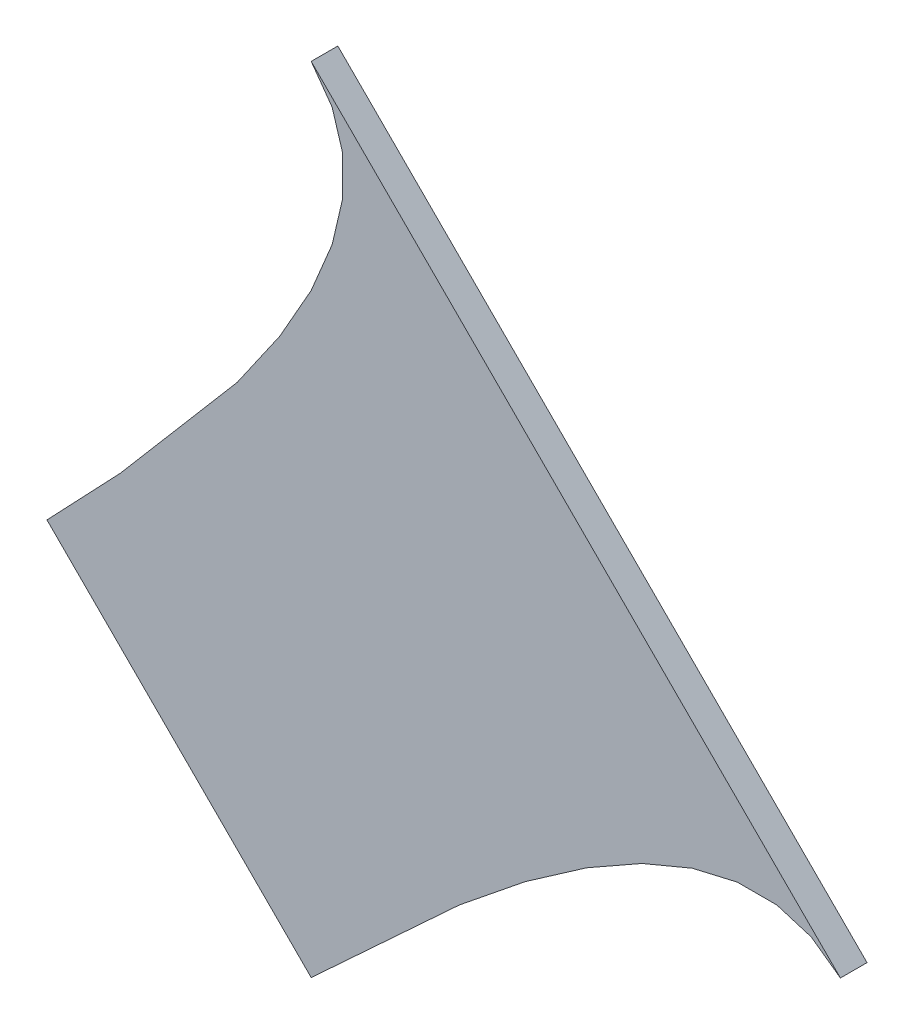
ISO-10303-21;
HEADER;
FILE_DESCRIPTION(('STEP AP214'),'2;1');
FILE_NAME('part.step','',(''),(''),'','','');
FILE_SCHEMA(('AUTOMOTIVE_DESIGN { 1 0 10303 214 1 1 1 1 }'));
ENDSEC;
DATA;
#1=APPLICATION_CONTEXT('core data for automotive mechanical design processes');
#2=APPLICATION_PROTOCOL_DEFINITION('international standard','automotive_design',2000,#1);
#3=PRODUCT_CONTEXT('',#1,'mechanical');
#4=PRODUCT('Part','Part','',(#3));
#5=PRODUCT_RELATED_PRODUCT_CATEGORY('part','',(#4));
#6=PRODUCT_DEFINITION_FORMATION('','',#4);
#7=PRODUCT_DEFINITION_CONTEXT('part definition',#1,'design');
#8=PRODUCT_DEFINITION('design','',#6,#7);
#9=PRODUCT_DEFINITION_SHAPE('','',#8);
#10=(LENGTH_UNIT() NAMED_UNIT(*) SI_UNIT(.MILLI.,.METRE.));
#11=(NAMED_UNIT(*) PLANE_ANGLE_UNIT() SI_UNIT($,.RADIAN.));
#12=(NAMED_UNIT(*) SI_UNIT($,.STERADIAN.) SOLID_ANGLE_UNIT());
#13=UNCERTAINTY_MEASURE_WITH_UNIT(LENGTH_MEASURE(1.E-05),#10,'distance_accuracy_value','');
#14=(GEOMETRIC_REPRESENTATION_CONTEXT(3) GLOBAL_UNCERTAINTY_ASSIGNED_CONTEXT((#13)) GLOBAL_UNIT_ASSIGNED_CONTEXT((#10,
#11,#12)) REPRESENTATION_CONTEXT('',''));
#15=CARTESIAN_POINT('',(0.,0.,0.));
#16=DIRECTION('',(0.,0.,1.));
#17=DIRECTION('',(1.,0.,0.));
#18=AXIS2_PLACEMENT_3D('',#15,#16,#17);
#19=CARTESIAN_POINT('',(90.5439987182617,115.928001403809,0.));
#20=DIRECTION('',(-0.678743033938284,0.734375853279677,0.));
#21=DIRECTION('',(0.734375853279677,0.678743033938284,0.));
#22=AXIS2_PLACEMENT_3D('',#19,#20,#21);
#23=PLANE('',#22);
#24=DIRECTION('',(0.734375853279677,0.678743033938284,0.));
#25=VECTOR('',#24,1.);
#26=CARTESIAN_POINT('',(90.5439987182617,115.928001403809,0.03556));
#27=LINE('',#26,#25);
#28=CARTESIAN_POINT('',(90.5439987182617,115.928001403809,0.03556));
#29=VERTEX_POINT('',#28);
#30=CARTESIAN_POINT('',(90.7419967651367,116.111000061035,0.03556));
#31=VERTEX_POINT('',#30);
#32=EDGE_CURVE('E11',#29,#31,#27,.T.);
#33=ORIENTED_EDGE('',*,*,#32,.F.);
#34=DIRECTION('',(0.,0.,1.));
#35=VECTOR('',#34,1.);
#36=CARTESIAN_POINT('',(90.5439987182617,115.928001403809,0.));
#37=LINE('',#36,#35);
#38=CARTESIAN_POINT('',(90.5439987182617,115.928001403809,0.));
#39=VERTEX_POINT('',#38);
#40=EDGE_CURVE('E24',#39,#29,#37,.T.);
#41=ORIENTED_EDGE('',*,*,#40,.F.);
#42=DIRECTION('',(0.734375853279677,0.678743033938284,0.));
#43=VECTOR('',#42,1.);
#44=CARTESIAN_POINT('',(90.5439987182617,115.928001403809,0.));
#45=LINE('',#44,#43);
#46=CARTESIAN_POINT('',(90.7419967651367,116.111000061035,0.));
#47=VERTEX_POINT('',#46);
#48=EDGE_CURVE('E172',#39,#47,#45,.T.);
#49=ORIENTED_EDGE('',*,*,#48,.T.);
#50=DIRECTION('',(0.,0.,1.));
#51=VECTOR('',#50,1.);
#52=CARTESIAN_POINT('',(90.7419967651367,116.111000061035,0.));
#53=LINE('',#52,#51);
#54=EDGE_CURVE('E37',#47,#31,#53,.T.);
#55=ORIENTED_EDGE('',*,*,#54,.T.);
#56=EDGE_LOOP('',(#33,#41,#49,#55));
#57=FACE_BOUND('',#56,.T.);
#58=ADVANCED_FACE('F17',(#57),#23,.F.);
#59=CARTESIAN_POINT('',(90.7419967651367,116.111000061035,0.));
#60=DIRECTION('',(-0.627898828977901,0.778294970154748,0.));
#61=DIRECTION('',(0.778294970154748,0.627898828977901,0.));
#62=AXIS2_PLACEMENT_3D('',#59,#60,#61);
#63=PLANE('',#62);
#64=DIRECTION('',(0.778294970154748,0.627898828977901,0.));
#65=VECTOR('',#64,1.);
#66=CARTESIAN_POINT('',(90.7419967651367,116.111000061035,0.03556));
#67=LINE('',#66,#65);
#68=CARTESIAN_POINT('',(90.8300018310547,116.181999206543,0.03556));
#69=VERTEX_POINT('',#68);
#70=EDGE_CURVE('E308',#31,#69,#67,.T.);
#71=ORIENTED_EDGE('',*,*,#70,.F.);
#72=ORIENTED_EDGE('',*,*,#54,.F.);
#73=DIRECTION('',(0.778294970154748,0.627898828977901,0.));
#74=VECTOR('',#73,1.);
#75=CARTESIAN_POINT('',(90.7419967651367,116.111000061035,0.));
#76=LINE('',#75,#74);
#77=CARTESIAN_POINT('',(90.8300018310547,116.181999206543,0.));
#78=VERTEX_POINT('',#77);
#79=EDGE_CURVE('E305',#47,#78,#76,.T.);
#80=ORIENTED_EDGE('',*,*,#79,.T.);
#81=DIRECTION('',(0.,0.,1.));
#82=VECTOR('',#81,1.);
#83=CARTESIAN_POINT('',(90.8300018310547,116.181999206543,0.));
#84=LINE('',#83,#82);
#85=EDGE_CURVE('E303',#78,#69,#84,.T.);
#86=ORIENTED_EDGE('',*,*,#85,.T.);
#87=EDGE_LOOP('',(#71,#72,#80,#86));
#88=FACE_BOUND('',#87,.T.);
#89=ADVANCED_FACE('F316',(#88),#63,.F.);
#90=CARTESIAN_POINT('',(90.8300018310547,116.181999206543,0.));
#91=DIRECTION('',(-0.570762267595056,0.821115359672287,0.));
#92=DIRECTION('',(0.821115359672287,0.570762267595056,0.));
#93=AXIS2_PLACEMENT_3D('',#90,#91,#92);
#94=PLANE('',#93);
#95=DIRECTION('',(0.821115359672287,0.570762267595056,0.));
#96=VECTOR('',#95,1.);
#97=CARTESIAN_POINT('',(90.8300018310547,116.181999206543,0.03556));
#98=LINE('',#97,#96);
#99=CARTESIAN_POINT('',(90.9120025634766,116.238998413086,0.03556));
#100=VERTEX_POINT('',#99);
#101=EDGE_CURVE('E300',#69,#100,#98,.T.);
#102=ORIENTED_EDGE('',*,*,#101,.F.);
#103=ORIENTED_EDGE('',*,*,#85,.F.);
#104=DIRECTION('',(0.821115359672287,0.570762267595056,0.));
#105=VECTOR('',#104,1.);
#106=CARTESIAN_POINT('',(90.8300018310547,116.181999206543,0.));
#107=LINE('',#106,#105);
#108=CARTESIAN_POINT('',(90.9120025634766,116.238998413086,0.));
#109=VERTEX_POINT('',#108);
#110=EDGE_CURVE('E297',#78,#109,#107,.T.);
#111=ORIENTED_EDGE('',*,*,#110,.T.);
#112=DIRECTION('',(0.,0.,1.));
#113=VECTOR('',#112,1.);
#114=CARTESIAN_POINT('',(90.9120025634766,116.238998413086,0.));
#115=LINE('',#114,#113);
#116=EDGE_CURVE('E295',#109,#100,#115,.T.);
#117=ORIENTED_EDGE('',*,*,#116,.T.);
#118=EDGE_LOOP('',(#102,#103,#111,#117));
#119=FACE_BOUND('',#118,.T.);
#120=ADVANCED_FACE('F322',(#119),#94,.F.);
#121=CARTESIAN_POINT('',(90.9120025634766,116.238998413086,0.));
#122=DIRECTION('',(-0.493616517242774,0.869679673158522,0.));
#123=DIRECTION('',(0.869679673158522,0.493616517242774,0.));
#124=AXIS2_PLACEMENT_3D('',#121,#122,#123);
#125=PLANE('',#124);
#126=DIRECTION('',(0.869679673158522,0.493616517242774,0.));
#127=VECTOR('',#126,1.);
#128=CARTESIAN_POINT('',(90.9120025634766,116.238998413086,0.03556));
#129=LINE('',#128,#127);
#130=CARTESIAN_POINT('',(90.9860000610352,116.28099822998,0.03556));
#131=VERTEX_POINT('',#130);
#132=EDGE_CURVE('E292',#100,#131,#129,.T.);
#133=ORIENTED_EDGE('',*,*,#132,.F.);
#134=ORIENTED_EDGE('',*,*,#116,.F.);
#135=DIRECTION('',(0.869679673158522,0.493616517242774,0.));
#136=VECTOR('',#135,1.);
#137=CARTESIAN_POINT('',(90.9120025634766,116.238998413086,0.));
#138=LINE('',#137,#136);
#139=CARTESIAN_POINT('',(90.9860000610352,116.28099822998,0.));
#140=VERTEX_POINT('',#139);
#141=EDGE_CURVE('E289',#109,#140,#138,.T.);
#142=ORIENTED_EDGE('',*,*,#141,.T.);
#143=DIRECTION('',(0.,0.,1.));
#144=VECTOR('',#143,1.);
#145=CARTESIAN_POINT('',(90.9860000610352,116.28099822998,0.));
#146=LINE('',#145,#144);
#147=EDGE_CURVE('E287',#140,#131,#146,.T.);
#148=ORIENTED_EDGE('',*,*,#147,.T.);
#149=EDGE_LOOP('',(#133,#134,#142,#148));
#150=FACE_BOUND('',#149,.T.);
#151=ADVANCED_FACE('F324',(#150),#125,.F.);
#152=CARTESIAN_POINT('',(90.9860000610352,116.28099822998,0.));
#153=DIRECTION('',(-0.385584994163033,0.922672321182495,0.));
#154=DIRECTION('',(0.922672321182495,0.385584994163033,0.));
#155=AXIS2_PLACEMENT_3D('',#152,#153,#154);
#156=PLANE('',#155);
#157=DIRECTION('',(0.922672321182495,0.385584994163033,0.));
#158=VECTOR('',#157,1.);
#159=CARTESIAN_POINT('',(90.9860000610352,116.28099822998,0.03556));
#160=LINE('',#159,#158);
#161=CARTESIAN_POINT('',(91.0530014038086,116.30899810791,0.03556));
#162=VERTEX_POINT('',#161);
#163=EDGE_CURVE('E284',#131,#162,#160,.T.);
#164=ORIENTED_EDGE('',*,*,#163,.F.);
#165=ORIENTED_EDGE('',*,*,#147,.F.);
#166=DIRECTION('',(0.922672321182495,0.385584994163033,0.));
#167=VECTOR('',#166,1.);
#168=CARTESIAN_POINT('',(90.9860000610352,116.28099822998,0.));
#169=LINE('',#168,#167);
#170=CARTESIAN_POINT('',(91.0530014038086,116.30899810791,0.));
#171=VERTEX_POINT('',#170);
#172=EDGE_CURVE('E281',#140,#171,#169,.T.);
#173=ORIENTED_EDGE('',*,*,#172,.T.);
#174=DIRECTION('',(0.,0.,1.));
#175=VECTOR('',#174,1.);
#176=CARTESIAN_POINT('',(91.0530014038086,116.30899810791,0.));
#177=LINE('',#176,#175);
#178=EDGE_CURVE('E279',#171,#162,#177,.T.);
#179=ORIENTED_EDGE('',*,*,#178,.T.);
#180=EDGE_LOOP('',(#164,#165,#173,#179));
#181=FACE_BOUND('',#180,.T.);
#182=ADVANCED_FACE('F329',(#181),#156,.F.);
#183=CARTESIAN_POINT('',(91.0530014038086,116.30899810791,0.));
#184=DIRECTION('',(-0.227237445006023,0.973839382848699,0.));
#185=DIRECTION('',(0.973839382848699,0.227237445006023,0.));
#186=AXIS2_PLACEMENT_3D('',#183,#184,#185);
#187=PLANE('',#186);
#188=DIRECTION('',(0.973839382848699,0.227237445006023,0.));
#189=VECTOR('',#188,1.);
#190=CARTESIAN_POINT('',(91.0530014038086,116.30899810791,0.03556));
#191=LINE('',#190,#189);
#192=CARTESIAN_POINT('',(91.1129989624023,116.322998046875,0.03556));
#193=VERTEX_POINT('',#192);
#194=EDGE_CURVE('E276',#162,#193,#191,.T.);
#195=ORIENTED_EDGE('',*,*,#194,.F.);
#196=ORIENTED_EDGE('',*,*,#178,.F.);
#197=DIRECTION('',(0.973839382848699,0.227237445006023,0.));
#198=VECTOR('',#197,1.);
#199=CARTESIAN_POINT('',(91.0530014038086,116.30899810791,0.));
#200=LINE('',#199,#198);
#201=CARTESIAN_POINT('',(91.1129989624023,116.322998046875,0.));
#202=VERTEX_POINT('',#201);
#203=EDGE_CURVE('E273',#171,#202,#200,.T.);
#204=ORIENTED_EDGE('',*,*,#203,.T.);
#205=DIRECTION('',(0.,0.,1.));
#206=VECTOR('',#205,1.);
#207=CARTESIAN_POINT('',(91.1129989624023,116.322998046875,0.));
#208=LINE('',#207,#206);
#209=EDGE_CURVE('E271',#202,#193,#208,.T.);
#210=ORIENTED_EDGE('',*,*,#209,.T.);
#211=EDGE_LOOP('',(#195,#196,#204,#210));
#212=FACE_BOUND('',#211,.T.);
#213=ADVANCED_FACE('F332',(#212),#187,.F.);
#214=CARTESIAN_POINT('',(91.1129989624023,116.322998046875,0.));
#215=DIRECTION('',(0.,1.,0.));
#216=DIRECTION('',(1.,0.,0.));
#217=AXIS2_PLACEMENT_3D('',#214,#215,#216);
#218=PLANE('',#217);
#219=DIRECTION('',(1.,0.,0.));
#220=VECTOR('',#219,1.);
#221=CARTESIAN_POINT('',(91.1129989624023,116.322998046875,0.03556));
#222=LINE('',#221,#220);
#223=CARTESIAN_POINT('',(91.1660003662109,116.322998046875,0.03556));
#224=VERTEX_POINT('',#223);
#225=EDGE_CURVE('E268',#193,#224,#222,.T.);
#226=ORIENTED_EDGE('',*,*,#225,.F.);
#227=ORIENTED_EDGE('',*,*,#209,.F.);
#228=DIRECTION('',(1.,0.,0.));
#229=VECTOR('',#228,1.);
#230=CARTESIAN_POINT('',(91.1129989624023,116.322998046875,0.));
#231=LINE('',#230,#229);
#232=CARTESIAN_POINT('',(91.1660003662109,116.322998046875,0.));
#233=VERTEX_POINT('',#232);
#234=EDGE_CURVE('E265',#202,#233,#231,.T.);
#235=ORIENTED_EDGE('',*,*,#234,.T.);
#236=DIRECTION('',(0.,0.,1.));
#237=VECTOR('',#236,1.);
#238=CARTESIAN_POINT('',(91.1660003662109,116.322998046875,0.));
#239=LINE('',#238,#237);
#240=EDGE_CURVE('E263',#233,#224,#239,.T.);
#241=ORIENTED_EDGE('',*,*,#240,.T.);
#242=EDGE_LOOP('',(#226,#227,#235,#241));
#243=FACE_BOUND('',#242,.T.);
#244=ADVANCED_FACE('F337',(#243),#218,.F.);
#245=CARTESIAN_POINT('',(91.1660003662109,116.322998046875,0.));
#246=DIRECTION('',(0.291174244115219,0.956670036932239,0.));
#247=DIRECTION('',(0.956670036932239,-0.291174244115219,0.));
#248=AXIS2_PLACEMENT_3D('',#245,#246,#247);
#249=PLANE('',#248);
#250=DIRECTION('',(0.956670036932239,-0.291174244115219,0.));
#251=VECTOR('',#250,1.);
#252=CARTESIAN_POINT('',(91.1660003662109,116.322998046875,0.03556));
#253=LINE('',#252,#251);
#254=CARTESIAN_POINT('',(91.2119979858398,116.30899810791,0.03556));
#255=VERTEX_POINT('',#254);
#256=EDGE_CURVE('E260',#224,#255,#253,.T.);
#257=ORIENTED_EDGE('',*,*,#256,.F.);
#258=ORIENTED_EDGE('',*,*,#240,.F.);
#259=DIRECTION('',(0.956670036932239,-0.291174244115219,0.));
#260=VECTOR('',#259,1.);
#261=CARTESIAN_POINT('',(91.1660003662109,116.322998046875,0.));
#262=LINE('',#261,#260);
#263=CARTESIAN_POINT('',(91.2119979858398,116.30899810791,0.));
#264=VERTEX_POINT('',#263);
#265=EDGE_CURVE('E257',#233,#264,#262,.T.);
#266=ORIENTED_EDGE('',*,*,#265,.T.);
#267=DIRECTION('',(0.,0.,1.));
#268=VECTOR('',#267,1.);
#269=CARTESIAN_POINT('',(91.2119979858398,116.30899810791,0.));
#270=LINE('',#269,#268);
#271=EDGE_CURVE('E255',#264,#255,#270,.T.);
#272=ORIENTED_EDGE('',*,*,#271,.T.);
#273=EDGE_LOOP('',(#257,#258,#266,#272));
#274=FACE_BOUND('',#273,.T.);
#275=ADVANCED_FACE('F340',(#274),#249,.F.);
#276=CARTESIAN_POINT('',(91.2119979858398,116.30899810791,0.));
#277=DIRECTION('',(0.583190650931696,0.812335315412216,0.));
#278=DIRECTION('',(0.812335315412216,-0.583190650931696,0.));
#279=AXIS2_PLACEMENT_3D('',#276,#277,#278);
#280=PLANE('',#279);
#281=DIRECTION('',(0.812335315412216,-0.583190650931696,0.));
#282=VECTOR('',#281,1.);
#283=CARTESIAN_POINT('',(91.2119979858398,116.30899810791,0.03556));
#284=LINE('',#283,#282);
#285=CARTESIAN_POINT('',(91.2509994506836,116.28099822998,0.03556));
#286=VERTEX_POINT('',#285);
#287=EDGE_CURVE('E252',#255,#286,#284,.T.);
#288=ORIENTED_EDGE('',*,*,#287,.F.);
#289=ORIENTED_EDGE('',*,*,#271,.F.);
#290=DIRECTION('',(0.812335315412216,-0.583190650931696,0.));
#291=VECTOR('',#290,1.);
#292=CARTESIAN_POINT('',(91.2119979858398,116.30899810791,0.));
#293=LINE('',#292,#291);
#294=CARTESIAN_POINT('',(91.2509994506836,116.28099822998,0.));
#295=VERTEX_POINT('',#294);
#296=EDGE_CURVE('E249',#264,#295,#293,.T.);
#297=ORIENTED_EDGE('',*,*,#296,.T.);
#298=DIRECTION('',(0.,0.,1.));
#299=VECTOR('',#298,1.);
#300=CARTESIAN_POINT('',(91.2509994506836,116.28099822998,0.));
#301=LINE('',#300,#299);
#302=EDGE_CURVE('E247',#295,#286,#301,.T.);
#303=ORIENTED_EDGE('',*,*,#302,.T.);
#304=EDGE_LOOP('',(#288,#289,#297,#303));
#305=FACE_BOUND('',#304,.T.);
#306=ADVANCED_FACE('F345',(#305),#280,.F.);
#307=CARTESIAN_POINT('',(91.2509994506836,116.28099822998,0.));
#308=DIRECTION('',(-0.707106781186548,-0.707106781186548,0.));
#309=DIRECTION('',(-0.707106781186548,0.707106781186548,0.));
#310=AXIS2_PLACEMENT_3D('',#307,#308,#309);
#311=PLANE('',#310);
#312=DIRECTION('',(-0.707106781186548,0.707106781186548,0.));
#313=VECTOR('',#312,1.);
#314=CARTESIAN_POINT('',(91.2509994506836,116.28099822998,0.03556));
#315=LINE('',#314,#313);
#316=CARTESIAN_POINT('',(90.5439987182617,116.987998962402,0.03556));
#317=VERTEX_POINT('',#316);
#318=EDGE_CURVE('E244',#286,#317,#315,.T.);
#319=ORIENTED_EDGE('',*,*,#318,.F.);
#320=ORIENTED_EDGE('',*,*,#302,.F.);
#321=DIRECTION('',(-0.707106781186548,0.707106781186548,0.));
#322=VECTOR('',#321,1.);
#323=CARTESIAN_POINT('',(91.2509994506836,116.28099822998,0.));
#324=LINE('',#323,#322);
#325=CARTESIAN_POINT('',(90.5439987182617,116.987998962402,0.));
#326=VERTEX_POINT('',#325);
#327=EDGE_CURVE('E241',#295,#326,#324,.T.);
#328=ORIENTED_EDGE('',*,*,#327,.T.);
#329=DIRECTION('',(0.,0.,1.));
#330=VECTOR('',#329,1.);
#331=CARTESIAN_POINT('',(90.5439987182617,116.987998962402,0.));
#332=LINE('',#331,#330);
#333=EDGE_CURVE('E239',#326,#317,#332,.T.);
#334=ORIENTED_EDGE('',*,*,#333,.T.);
#335=EDGE_LOOP('',(#319,#320,#328,#334));
#336=FACE_BOUND('',#335,.T.);
#337=ADVANCED_FACE('F348',(#336),#311,.F.);
#338=CARTESIAN_POINT('',(90.5439987182617,116.987998962402,0.));
#339=DIRECTION('',(0.812335315412216,0.583190650931696,0.));
#340=DIRECTION('',(0.583190650931696,-0.812335315412216,0.));
#341=AXIS2_PLACEMENT_3D('',#338,#339,#340);
#342=PLANE('',#341);
#343=DIRECTION('',(0.583190650931696,-0.812335315412216,0.));
#344=VECTOR('',#343,1.);
#345=CARTESIAN_POINT('',(90.5439987182617,116.987998962402,0.03556));
#346=LINE('',#345,#344);
#347=CARTESIAN_POINT('',(90.5719985961914,116.948997497559,0.03556));
#348=VERTEX_POINT('',#347);
#349=EDGE_CURVE('E236',#317,#348,#346,.T.);
#350=ORIENTED_EDGE('',*,*,#349,.F.);
#351=ORIENTED_EDGE('',*,*,#333,.F.);
#352=DIRECTION('',(0.583190650931696,-0.812335315412216,0.));
#353=VECTOR('',#352,1.);
#354=CARTESIAN_POINT('',(90.5439987182617,116.987998962402,0.));
#355=LINE('',#354,#353);
#356=CARTESIAN_POINT('',(90.5719985961914,116.948997497559,0.));
#357=VERTEX_POINT('',#356);
#358=EDGE_CURVE('E233',#326,#357,#355,.T.);
#359=ORIENTED_EDGE('',*,*,#358,.T.);
#360=DIRECTION('',(0.,0.,1.));
#361=VECTOR('',#360,1.);
#362=CARTESIAN_POINT('',(90.5719985961914,116.948997497559,0.));
#363=LINE('',#362,#361);
#364=EDGE_CURVE('E231',#357,#348,#363,.T.);
#365=ORIENTED_EDGE('',*,*,#364,.T.);
#366=EDGE_LOOP('',(#350,#351,#359,#365));
#367=FACE_BOUND('',#366,.T.);
#368=ADVANCED_FACE('F353',(#367),#342,.F.);
#369=CARTESIAN_POINT('',(90.5719985961914,116.948997497559,0.));
#370=DIRECTION('',(0.956670036932239,0.291174244115219,0.));
#371=DIRECTION('',(0.291174244115219,-0.956670036932239,0.));
#372=AXIS2_PLACEMENT_3D('',#369,#370,#371);
#373=PLANE('',#372);
#374=DIRECTION('',(0.291174244115219,-0.956670036932239,0.));
#375=VECTOR('',#374,1.);
#376=CARTESIAN_POINT('',(90.5719985961914,116.948997497559,0.03556));
#377=LINE('',#376,#375);
#378=CARTESIAN_POINT('',(90.5859985351562,116.90299987793,0.03556));
#379=VERTEX_POINT('',#378);
#380=EDGE_CURVE('E228',#348,#379,#377,.T.);
#381=ORIENTED_EDGE('',*,*,#380,.F.);
#382=ORIENTED_EDGE('',*,*,#364,.F.);
#383=DIRECTION('',(0.291174244115219,-0.956670036932239,0.));
#384=VECTOR('',#383,1.);
#385=CARTESIAN_POINT('',(90.5719985961914,116.948997497559,0.));
#386=LINE('',#385,#384);
#387=CARTESIAN_POINT('',(90.5859985351562,116.90299987793,0.));
#388=VERTEX_POINT('',#387);
#389=EDGE_CURVE('E225',#357,#388,#386,.T.);
#390=ORIENTED_EDGE('',*,*,#389,.T.);
#391=DIRECTION('',(0.,0.,1.));
#392=VECTOR('',#391,1.);
#393=CARTESIAN_POINT('',(90.5859985351562,116.90299987793,0.));
#394=LINE('',#393,#392);
#395=EDGE_CURVE('E223',#388,#379,#394,.T.);
#396=ORIENTED_EDGE('',*,*,#395,.T.);
#397=EDGE_LOOP('',(#381,#382,#390,#396));
#398=FACE_BOUND('',#397,.T.);
#399=ADVANCED_FACE('F356',(#398),#373,.F.);
#400=CARTESIAN_POINT('',(90.5859985351562,116.90299987793,0.));
#401=DIRECTION('',(1.,0.,0.));
#402=DIRECTION('',(0.,-1.,0.));
#403=AXIS2_PLACEMENT_3D('',#400,#401,#402);
#404=PLANE('',#403);
#405=DIRECTION('',(0.,-1.,0.));
#406=VECTOR('',#405,1.);
#407=CARTESIAN_POINT('',(90.5859985351562,116.90299987793,0.03556));
#408=LINE('',#407,#406);
#409=CARTESIAN_POINT('',(90.5859985351562,116.849998474121,0.03556));
#410=VERTEX_POINT('',#409);
#411=EDGE_CURVE('E220',#379,#410,#408,.T.);
#412=ORIENTED_EDGE('',*,*,#411,.F.);
#413=ORIENTED_EDGE('',*,*,#395,.F.);
#414=DIRECTION('',(0.,-1.,0.));
#415=VECTOR('',#414,1.);
#416=CARTESIAN_POINT('',(90.5859985351562,116.90299987793,0.));
#417=LINE('',#416,#415);
#418=CARTESIAN_POINT('',(90.5859985351562,116.849998474121,0.));
#419=VERTEX_POINT('',#418);
#420=EDGE_CURVE('E217',#388,#419,#417,.T.);
#421=ORIENTED_EDGE('',*,*,#420,.T.);
#422=DIRECTION('',(0.,0.,1.));
#423=VECTOR('',#422,1.);
#424=CARTESIAN_POINT('',(90.5859985351562,116.849998474121,0.));
#425=LINE('',#424,#423);
#426=EDGE_CURVE('E215',#419,#410,#425,.T.);
#427=ORIENTED_EDGE('',*,*,#426,.T.);
#428=EDGE_LOOP('',(#412,#413,#421,#427));
#429=FACE_BOUND('',#428,.T.);
#430=ADVANCED_FACE('F361',(#429),#404,.F.);
#431=CARTESIAN_POINT('',(90.5859985351562,116.849998474121,0.));
#432=DIRECTION('',(0.973839382848699,-0.227237445006023,0.));
#433=DIRECTION('',(-0.227237445006023,-0.973839382848699,0.));
#434=AXIS2_PLACEMENT_3D('',#431,#432,#433);
#435=PLANE('',#434);
#436=DIRECTION('',(-0.227237445006023,-0.973839382848699,0.));
#437=VECTOR('',#436,1.);
#438=CARTESIAN_POINT('',(90.5859985351562,116.849998474121,0.03556));
#439=LINE('',#438,#437);
#440=CARTESIAN_POINT('',(90.5719985961914,116.790000915527,0.03556));
#441=VERTEX_POINT('',#440);
#442=EDGE_CURVE('E212',#410,#441,#439,.T.);
#443=ORIENTED_EDGE('',*,*,#442,.F.);
#444=ORIENTED_EDGE('',*,*,#426,.F.);
#445=DIRECTION('',(-0.227237445006023,-0.973839382848699,0.));
#446=VECTOR('',#445,1.);
#447=CARTESIAN_POINT('',(90.5859985351562,116.849998474121,0.));
#448=LINE('',#447,#446);
#449=CARTESIAN_POINT('',(90.5719985961914,116.790000915527,0.));
#450=VERTEX_POINT('',#449);
#451=EDGE_CURVE('E209',#419,#450,#448,.T.);
#452=ORIENTED_EDGE('',*,*,#451,.T.);
#453=DIRECTION('',(0.,0.,1.));
#454=VECTOR('',#453,1.);
#455=CARTESIAN_POINT('',(90.5719985961914,116.790000915527,0.));
#456=LINE('',#455,#454);
#457=EDGE_CURVE('E207',#450,#441,#456,.T.);
#458=ORIENTED_EDGE('',*,*,#457,.T.);
#459=EDGE_LOOP('',(#443,#444,#452,#458));
#460=FACE_BOUND('',#459,.T.);
#461=ADVANCED_FACE('F364',(#460),#435,.F.);
#462=CARTESIAN_POINT('',(90.5719985961914,116.790000915527,0.));
#463=DIRECTION('',(0.922672321182495,-0.385584994163033,0.));
#464=DIRECTION('',(-0.385584994163033,-0.922672321182495,0.));
#465=AXIS2_PLACEMENT_3D('',#462,#463,#464);
#466=PLANE('',#465);
#467=DIRECTION('',(-0.385584994163033,-0.922672321182495,0.));
#468=VECTOR('',#467,1.);
#469=CARTESIAN_POINT('',(90.5719985961914,116.790000915527,0.03556));
#470=LINE('',#469,#468);
#471=CARTESIAN_POINT('',(90.5439987182617,116.722999572754,0.03556));
#472=VERTEX_POINT('',#471);
#473=EDGE_CURVE('E204',#441,#472,#470,.T.);
#474=ORIENTED_EDGE('',*,*,#473,.F.);
#475=ORIENTED_EDGE('',*,*,#457,.F.);
#476=DIRECTION('',(-0.385584994163033,-0.922672321182495,0.));
#477=VECTOR('',#476,1.);
#478=CARTESIAN_POINT('',(90.5719985961914,116.790000915527,0.));
#479=LINE('',#478,#477);
#480=CARTESIAN_POINT('',(90.5439987182617,116.722999572754,0.));
#481=VERTEX_POINT('',#480);
#482=EDGE_CURVE('E201',#450,#481,#479,.T.);
#483=ORIENTED_EDGE('',*,*,#482,.T.);
#484=DIRECTION('',(0.,0.,1.));
#485=VECTOR('',#484,1.);
#486=CARTESIAN_POINT('',(90.5439987182617,116.722999572754,0.));
#487=LINE('',#486,#485);
#488=EDGE_CURVE('E199',#481,#472,#487,.T.);
#489=ORIENTED_EDGE('',*,*,#488,.T.);
#490=EDGE_LOOP('',(#474,#475,#483,#489));
#491=FACE_BOUND('',#490,.T.);
#492=ADVANCED_FACE('F369',(#491),#466,.F.);
#493=CARTESIAN_POINT('',(90.5439987182617,116.722999572754,0.));
#494=DIRECTION('',(0.869679673158522,-0.493616517242774,0.));
#495=DIRECTION('',(-0.493616517242774,-0.869679673158522,0.));
#496=AXIS2_PLACEMENT_3D('',#493,#494,#495);
#497=PLANE('',#496);
#498=DIRECTION('',(-0.493616517242774,-0.869679673158522,0.));
#499=VECTOR('',#498,1.);
#500=CARTESIAN_POINT('',(90.5439987182617,116.722999572754,0.03556));
#501=LINE('',#500,#499);
#502=CARTESIAN_POINT('',(90.5019989013672,116.649002075195,0.03556));
#503=VERTEX_POINT('',#502);
#504=EDGE_CURVE('E196',#472,#503,#501,.T.);
#505=ORIENTED_EDGE('',*,*,#504,.F.);
#506=ORIENTED_EDGE('',*,*,#488,.F.);
#507=DIRECTION('',(-0.493616517242774,-0.869679673158522,0.));
#508=VECTOR('',#507,1.);
#509=CARTESIAN_POINT('',(90.5439987182617,116.722999572754,0.));
#510=LINE('',#509,#508);
#511=CARTESIAN_POINT('',(90.5019989013672,116.649002075195,0.));
#512=VERTEX_POINT('',#511);
#513=EDGE_CURVE('E193',#481,#512,#510,.T.);
#514=ORIENTED_EDGE('',*,*,#513,.T.);
#515=DIRECTION('',(0.,0.,1.));
#516=VECTOR('',#515,1.);
#517=CARTESIAN_POINT('',(90.5019989013672,116.649002075195,0.));
#518=LINE('',#517,#516);
#519=EDGE_CURVE('E191',#512,#503,#518,.T.);
#520=ORIENTED_EDGE('',*,*,#519,.T.);
#521=EDGE_LOOP('',(#505,#506,#514,#520));
#522=FACE_BOUND('',#521,.T.);
#523=ADVANCED_FACE('F372',(#522),#497,.F.);
#524=CARTESIAN_POINT('',(90.5019989013672,116.649002075195,0.));
#525=DIRECTION('',(0.821115359672287,-0.570762267595056,0.));
#526=DIRECTION('',(-0.570762267595056,-0.821115359672287,0.));
#527=AXIS2_PLACEMENT_3D('',#524,#525,#526);
#528=PLANE('',#527);
#529=DIRECTION('',(-0.570762267595056,-0.821115359672287,0.));
#530=VECTOR('',#529,1.);
#531=CARTESIAN_POINT('',(90.5019989013672,116.649002075195,0.03556));
#532=LINE('',#531,#530);
#533=CARTESIAN_POINT('',(90.4449996948242,116.567001342773,0.03556));
#534=VERTEX_POINT('',#533);
#535=EDGE_CURVE('E188',#503,#534,#532,.T.);
#536=ORIENTED_EDGE('',*,*,#535,.F.);
#537=ORIENTED_EDGE('',*,*,#519,.F.);
#538=DIRECTION('',(-0.570762267595056,-0.821115359672287,0.));
#539=VECTOR('',#538,1.);
#540=CARTESIAN_POINT('',(90.5019989013672,116.649002075195,0.));
#541=LINE('',#540,#539);
#542=CARTESIAN_POINT('',(90.4449996948242,116.567001342773,0.));
#543=VERTEX_POINT('',#542);
#544=EDGE_CURVE('E185',#512,#543,#541,.T.);
#545=ORIENTED_EDGE('',*,*,#544,.T.);
#546=DIRECTION('',(0.,0.,1.));
#547=VECTOR('',#546,1.);
#548=CARTESIAN_POINT('',(90.4449996948242,116.567001342773,0.));
#549=LINE('',#548,#547);
#550=EDGE_CURVE('E183',#543,#534,#549,.T.);
#551=ORIENTED_EDGE('',*,*,#550,.T.);
#552=EDGE_LOOP('',(#536,#537,#545,#551));
#553=FACE_BOUND('',#552,.T.);
#554=ADVANCED_FACE('F377',(#553),#528,.F.);
#555=CARTESIAN_POINT('',(90.4449996948242,116.567001342773,0.));
#556=DIRECTION('',(0.761016375007054,-0.648732669881149,0.));
#557=DIRECTION('',(-0.648732669881149,-0.761016375007054,0.));
#558=AXIS2_PLACEMENT_3D('',#555,#556,#557);
#559=PLANE('',#558);
#560=DIRECTION('',(-0.648732669881149,-0.761016375007054,0.));
#561=VECTOR('',#560,1.);
#562=CARTESIAN_POINT('',(90.4449996948242,116.567001342773,0.03556));
#563=LINE('',#562,#561);
#564=CARTESIAN_POINT('',(90.2890014648438,116.384002685547,0.03556));
#565=VERTEX_POINT('',#564);
#566=EDGE_CURVE('E180',#534,#565,#563,.T.);
#567=ORIENTED_EDGE('',*,*,#566,.F.);
#568=ORIENTED_EDGE('',*,*,#550,.F.);
#569=DIRECTION('',(-0.648732669881149,-0.761016375007054,0.));
#570=VECTOR('',#569,1.);
#571=CARTESIAN_POINT('',(90.4449996948242,116.567001342773,0.));
#572=LINE('',#571,#570);
#573=CARTESIAN_POINT('',(90.2890014648438,116.384002685547,0.));
#574=VERTEX_POINT('',#573);
#575=EDGE_CURVE('E178',#543,#574,#572,.T.);
#576=ORIENTED_EDGE('',*,*,#575,.T.);
#577=DIRECTION('',(0.,0.,1.));
#578=VECTOR('',#577,1.);
#579=CARTESIAN_POINT('',(90.2890014648438,116.384002685547,0.));
#580=LINE('',#579,#578);
#581=EDGE_CURVE('E163',#574,#565,#580,.T.);
#582=ORIENTED_EDGE('',*,*,#581,.T.);
#583=EDGE_LOOP('',(#567,#568,#576,#582));
#584=FACE_BOUND('',#583,.T.);
#585=ADVANCED_FACE('F379',(#584),#559,.F.);
#586=CARTESIAN_POINT('',(90.2890014648438,116.384002685547,0.));
#587=DIRECTION('',(0.724488776913811,-0.689286596508252,0.));
#588=DIRECTION('',(-0.689286596508252,-0.724488776913811,0.));
#589=AXIS2_PLACEMENT_3D('',#586,#587,#588);
#590=PLANE('',#589);
#591=DIRECTION('',(-0.689286596508252,-0.724488776913811,0.));
#592=VECTOR('',#591,1.);
#593=CARTESIAN_POINT('',(90.2890014648438,116.384002685547,0.03556));
#594=LINE('',#593,#592);
#595=CARTESIAN_POINT('',(90.1910018920898,116.28099822998,0.03556));
#596=VERTEX_POINT('',#595);
#597=EDGE_CURVE('E167',#565,#596,#594,.T.);
#598=ORIENTED_EDGE('',*,*,#597,.F.);
#599=ORIENTED_EDGE('',*,*,#581,.F.);
#600=DIRECTION('',(-0.689286596508252,-0.724488776913811,0.));
#601=VECTOR('',#600,1.);
#602=CARTESIAN_POINT('',(90.2890014648438,116.384002685547,0.));
#603=LINE('',#602,#601);
#604=CARTESIAN_POINT('',(90.1910018920898,116.28099822998,0.));
#605=VERTEX_POINT('',#604);
#606=EDGE_CURVE('E159',#574,#605,#603,.T.);
#607=ORIENTED_EDGE('',*,*,#606,.T.);
#608=DIRECTION('',(0.,0.,1.));
#609=VECTOR('',#608,1.);
#610=CARTESIAN_POINT('',(90.1910018920898,116.28099822998,0.));
#611=LINE('',#610,#609);
#612=EDGE_CURVE('E149',#605,#596,#611,.T.);
#613=ORIENTED_EDGE('',*,*,#612,.T.);
#614=EDGE_LOOP('',(#598,#599,#607,#613));
#615=FACE_BOUND('',#614,.T.);
#616=ADVANCED_FACE('F162',(#615),#590,.F.);
#617=CARTESIAN_POINT('',(90.1910018920898,116.28099822998,0.));
#618=DIRECTION('',(0.707106781186548,0.707106781186548,0.));
#619=DIRECTION('',(0.707106781186548,-0.707106781186548,0.));
#620=AXIS2_PLACEMENT_3D('',#617,#618,#619);
#621=PLANE('',#620);
#622=DIRECTION('',(0.707106781186548,-0.707106781186548,0.));
#623=VECTOR('',#622,1.);
#624=CARTESIAN_POINT('',(90.1910018920898,116.28099822998,0.03556));
#625=LINE('',#624,#623);
#626=EDGE_CURVE('E155',#596,#29,#625,.T.);
#627=ORIENTED_EDGE('',*,*,#626,.F.);
#628=ORIENTED_EDGE('',*,*,#612,.F.);
#629=DIRECTION('',(0.707106781186548,-0.707106781186548,0.));
#630=VECTOR('',#629,1.);
#631=CARTESIAN_POINT('',(90.1910018920898,116.28099822998,0.));
#632=LINE('',#631,#630);
#633=EDGE_CURVE('E153',#605,#39,#632,.T.);
#634=ORIENTED_EDGE('',*,*,#633,.T.);
#635=ORIENTED_EDGE('',*,*,#40,.T.);
#636=EDGE_LOOP('',(#627,#628,#634,#635));
#637=FACE_BOUND('',#636,.T.);
#638=ADVANCED_FACE('F151',(#637),#621,.F.);
#639=CARTESIAN_POINT('',(90.5439987182617,115.928001403809,0.));
#640=DIRECTION('',(0.,0.,1.));
#641=DIRECTION('',(1.,0.,0.));
#642=AXIS2_PLACEMENT_3D('',#639,#640,#641);
#643=PLANE('',#642);
#644=ORIENTED_EDGE('',*,*,#633,.F.);
#645=ORIENTED_EDGE('',*,*,#606,.F.);
#646=ORIENTED_EDGE('',*,*,#575,.F.);
#647=ORIENTED_EDGE('',*,*,#544,.F.);
#648=ORIENTED_EDGE('',*,*,#513,.F.);
#649=ORIENTED_EDGE('',*,*,#482,.F.);
#650=ORIENTED_EDGE('',*,*,#451,.F.);
#651=ORIENTED_EDGE('',*,*,#420,.F.);
#652=ORIENTED_EDGE('',*,*,#389,.F.);
#653=ORIENTED_EDGE('',*,*,#358,.F.);
#654=ORIENTED_EDGE('',*,*,#327,.F.);
#655=ORIENTED_EDGE('',*,*,#296,.F.);
#656=ORIENTED_EDGE('',*,*,#265,.F.);
#657=ORIENTED_EDGE('',*,*,#234,.F.);
#658=ORIENTED_EDGE('',*,*,#203,.F.);
#659=ORIENTED_EDGE('',*,*,#172,.F.);
#660=ORIENTED_EDGE('',*,*,#141,.F.);
#661=ORIENTED_EDGE('',*,*,#110,.F.);
#662=ORIENTED_EDGE('',*,*,#79,.F.);
#663=ORIENTED_EDGE('',*,*,#48,.F.);
#664=EDGE_LOOP('',(#644,#645,#646,#647,#648,#649,#650,#651,#652,#653,#654,#655,#656,#657,#658,
#659,#660,#661,#662,#663));
#665=FACE_BOUND('',#664,.T.);
#666=ADVANCED_FACE('F170',(#665),#643,.F.);
#667=CARTESIAN_POINT('',(90.5439987182617,115.928001403809,0.03556));
#668=DIRECTION('',(0.,0.,1.));
#669=DIRECTION('',(1.,0.,0.));
#670=AXIS2_PLACEMENT_3D('',#667,#668,#669);
#671=PLANE('',#670);
#672=ORIENTED_EDGE('',*,*,#32,.T.);
#673=ORIENTED_EDGE('',*,*,#70,.T.);
#674=ORIENTED_EDGE('',*,*,#101,.T.);
#675=ORIENTED_EDGE('',*,*,#132,.T.);
#676=ORIENTED_EDGE('',*,*,#163,.T.);
#677=ORIENTED_EDGE('',*,*,#194,.T.);
#678=ORIENTED_EDGE('',*,*,#225,.T.);
#679=ORIENTED_EDGE('',*,*,#256,.T.);
#680=ORIENTED_EDGE('',*,*,#287,.T.);
#681=ORIENTED_EDGE('',*,*,#318,.T.);
#682=ORIENTED_EDGE('',*,*,#349,.T.);
#683=ORIENTED_EDGE('',*,*,#380,.T.);
#684=ORIENTED_EDGE('',*,*,#411,.T.);
#685=ORIENTED_EDGE('',*,*,#442,.T.);
#686=ORIENTED_EDGE('',*,*,#473,.T.);
#687=ORIENTED_EDGE('',*,*,#504,.T.);
#688=ORIENTED_EDGE('',*,*,#535,.T.);
#689=ORIENTED_EDGE('',*,*,#566,.T.);
#690=ORIENTED_EDGE('',*,*,#597,.T.);
#691=ORIENTED_EDGE('',*,*,#626,.T.);
#692=EDGE_LOOP('',(#672,#673,#674,#675,#676,#677,#678,#679,#680,#681,#682,#683,#684,#685,#686,
#687,#688,#689,#690,#691));
#693=FACE_BOUND('',#692,.T.);
#694=ADVANCED_FACE('F319',(#693),#671,.T.);
#695=CLOSED_SHELL('',(#58,#89,#120,#151,#182,#213,#244,#275,#306,#337,#368,#399,#430,#461,#492,
#523,#554,#585,#616,#638,#666,#694));
#696=MANIFOLD_SOLID_BREP('B1',#695);
#697=ADVANCED_BREP_SHAPE_REPRESENTATION('',(#18,#696),#14);
#698=SHAPE_DEFINITION_REPRESENTATION(#9,#697);
ENDSEC;
END-ISO-10303-21;
